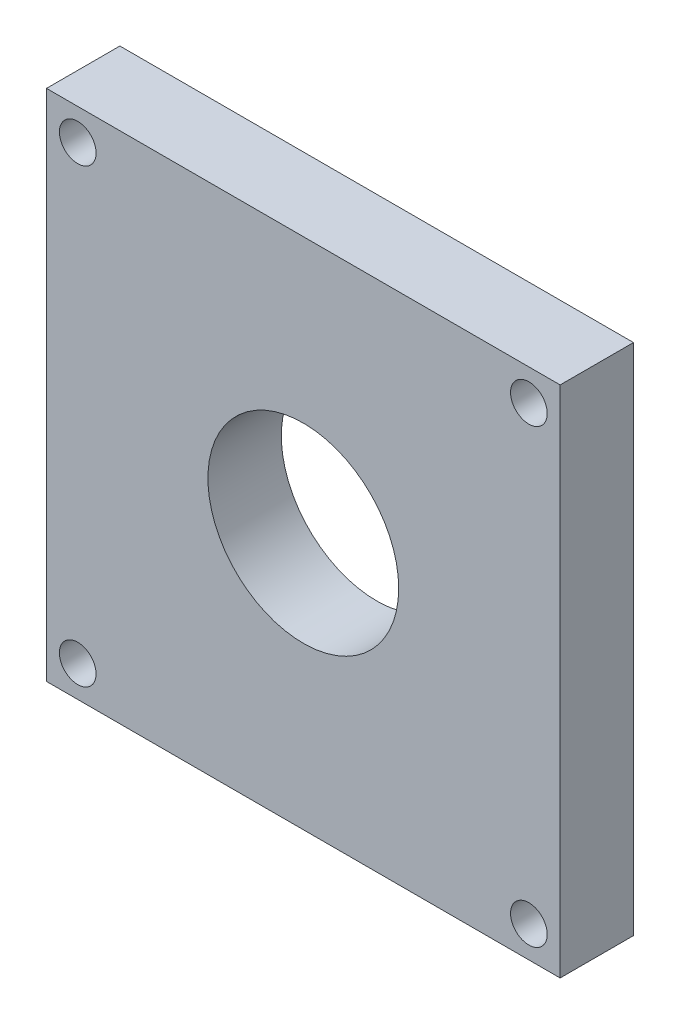
ISO-10303-21;
HEADER;
FILE_DESCRIPTION(('STEP AP214'),'2;1');
FILE_NAME('part.step','',(''),(''),'','','');
FILE_SCHEMA(('AUTOMOTIVE_DESIGN { 1 0 10303 214 1 1 1 1 }'));
ENDSEC;
DATA;
#1=APPLICATION_CONTEXT('core data for automotive mechanical design processes');
#2=APPLICATION_PROTOCOL_DEFINITION('international standard','automotive_design',2000,#1);
#3=PRODUCT_CONTEXT('',#1,'mechanical');
#4=PRODUCT('Part','Part','',(#3));
#5=PRODUCT_RELATED_PRODUCT_CATEGORY('part','',(#4));
#6=PRODUCT_DEFINITION_FORMATION('','',#4);
#7=PRODUCT_DEFINITION_CONTEXT('part definition',#1,'design');
#8=PRODUCT_DEFINITION('design','',#6,#7);
#9=PRODUCT_DEFINITION_SHAPE('','',#8);
#10=(LENGTH_UNIT() NAMED_UNIT(*) SI_UNIT(.MILLI.,.METRE.));
#11=(NAMED_UNIT(*) PLANE_ANGLE_UNIT() SI_UNIT($,.RADIAN.));
#12=(NAMED_UNIT(*) SI_UNIT($,.STERADIAN.) SOLID_ANGLE_UNIT());
#13=UNCERTAINTY_MEASURE_WITH_UNIT(LENGTH_MEASURE(1.E-05),#10,'distance_accuracy_value','');
#14=(GEOMETRIC_REPRESENTATION_CONTEXT(3) GLOBAL_UNCERTAINTY_ASSIGNED_CONTEXT((#13)) GLOBAL_UNIT_ASSIGNED_CONTEXT((#10,
#11,#12)) REPRESENTATION_CONTEXT('',''));
#15=CARTESIAN_POINT('',(0.,0.,0.));
#16=DIRECTION('',(0.,0.,1.));
#17=DIRECTION('',(1.,0.,0.));
#18=AXIS2_PLACEMENT_3D('',#15,#16,#17);
#19=CARTESIAN_POINT('',(0.,0.,5.));
#20=DIRECTION('',(0.,0.,1.));
#21=DIRECTION('',(1.,0.,0.));
#22=AXIS2_PLACEMENT_3D('',#19,#20,#21);
#23=PLANE('',#22);
#24=CARTESIAN_POINT('',(-15.37,-15.37,5.));
#25=DIRECTION('',(0.,0.,1.));
#26=DIRECTION('',(1.,0.,0.));
#27=AXIS2_PLACEMENT_3D('',#24,#25,#26);
#28=CIRCLE('',#27,1.25);
#29=CARTESIAN_POINT('',(-14.12,-15.37,5.));
#30=VERTEX_POINT('',#29);
#31=EDGE_CURVE('E127',#30,#30,#28,.T.);
#32=ORIENTED_EDGE('',*,*,#31,.F.);
#33=EDGE_LOOP('',(#32));
#34=FACE_BOUND('',#33,.T.);
#35=CARTESIAN_POINT('',(15.37,15.37,5.));
#36=DIRECTION('',(0.,0.,1.));
#37=DIRECTION('',(1.,0.,0.));
#38=AXIS2_PLACEMENT_3D('',#35,#36,#37);
#39=CIRCLE('',#38,1.25);
#40=CARTESIAN_POINT('',(16.62,15.37,5.));
#41=VERTEX_POINT('',#40);
#42=EDGE_CURVE('E115',#41,#41,#39,.T.);
#43=ORIENTED_EDGE('',*,*,#42,.F.);
#44=EDGE_LOOP('',(#43));
#45=FACE_BOUND('',#44,.T.);
#46=DIRECTION('',(0.,-1.,0.));
#47=VECTOR('',#46,1.);
#48=CARTESIAN_POINT('',(-17.5,-17.5,5.));
#49=LINE('',#48,#47);
#50=CARTESIAN_POINT('',(-17.5,17.5,5.));
#51=VERTEX_POINT('',#50);
#52=CARTESIAN_POINT('',(-17.5,-17.5,5.));
#53=VERTEX_POINT('',#52);
#54=EDGE_CURVE('E85',#51,#53,#49,.T.);
#55=ORIENTED_EDGE('',*,*,#54,.T.);
#56=DIRECTION('',(1.,0.,0.));
#57=VECTOR('',#56,1.);
#58=CARTESIAN_POINT('',(17.5,-17.5,5.));
#59=LINE('',#58,#57);
#60=CARTESIAN_POINT('',(17.5,-17.5,5.));
#61=VERTEX_POINT('',#60);
#62=EDGE_CURVE('E80',#53,#61,#59,.T.);
#63=ORIENTED_EDGE('',*,*,#62,.T.);
#64=DIRECTION('',(0.,1.,0.));
#65=VECTOR('',#64,1.);
#66=CARTESIAN_POINT('',(17.5,-17.5,5.));
#67=LINE('',#66,#65);
#68=CARTESIAN_POINT('',(17.5,17.5,5.));
#69=VERTEX_POINT('',#68);
#70=EDGE_CURVE('E83',#61,#69,#67,.T.);
#71=ORIENTED_EDGE('',*,*,#70,.T.);
#72=DIRECTION('',(-1.,0.,0.));
#73=VECTOR('',#72,1.);
#74=CARTESIAN_POINT('',(17.5,17.5,5.));
#75=LINE('',#74,#73);
#76=EDGE_CURVE('E50',#69,#51,#75,.T.);
#77=ORIENTED_EDGE('',*,*,#76,.T.);
#78=EDGE_LOOP('',(#55,#63,#71,#77));
#79=FACE_BOUND('',#78,.T.);
#80=CARTESIAN_POINT('',(-15.37,15.37,5.));
#81=DIRECTION('',(0.,0.,1.));
#82=DIRECTION('',(1.,0.,0.));
#83=AXIS2_PLACEMENT_3D('',#80,#81,#82);
#84=CIRCLE('',#83,1.25);
#85=CARTESIAN_POINT('',(-14.12,15.37,5.));
#86=VERTEX_POINT('',#85);
#87=EDGE_CURVE('E100',#86,#86,#84,.T.);
#88=ORIENTED_EDGE('',*,*,#87,.F.);
#89=EDGE_LOOP('',(#88));
#90=FACE_BOUND('',#89,.T.);
#91=CARTESIAN_POINT('',(15.37,-15.37,5.));
#92=DIRECTION('',(0.,0.,1.));
#93=DIRECTION('',(1.,0.,0.));
#94=AXIS2_PLACEMENT_3D('',#91,#92,#93);
#95=CIRCLE('',#94,1.25);
#96=CARTESIAN_POINT('',(16.62,-15.37,5.));
#97=VERTEX_POINT('',#96);
#98=EDGE_CURVE('E121',#97,#97,#95,.T.);
#99=ORIENTED_EDGE('',*,*,#98,.F.);
#100=EDGE_LOOP('',(#99));
#101=FACE_BOUND('',#100,.T.);
#102=CARTESIAN_POINT('',(0.,0.,5.));
#103=DIRECTION('',(0.,0.,1.));
#104=DIRECTION('',(1.,0.,0.));
#105=AXIS2_PLACEMENT_3D('',#102,#103,#104);
#106=CIRCLE('',#105,6.5);
#107=CARTESIAN_POINT('',(6.5,0.,5.));
#108=VERTEX_POINT('',#107);
#109=EDGE_CURVE('E133',#108,#108,#106,.T.);
#110=ORIENTED_EDGE('',*,*,#109,.F.);
#111=EDGE_LOOP('',(#110));
#112=FACE_BOUND('',#111,.T.);
#113=ADVANCED_FACE('F33',(#34,#45,#79,#90,#101,#112),#23,.T.);
#114=CARTESIAN_POINT('',(0.,0.,0.));
#115=DIRECTION('',(0.,0.,1.));
#116=DIRECTION('',(1.,0.,0.));
#117=AXIS2_PLACEMENT_3D('',#114,#115,#116);
#118=PLANE('',#117);
#119=DIRECTION('',(0.,-1.,0.));
#120=VECTOR('',#119,1.);
#121=CARTESIAN_POINT('',(-17.5,-17.5,0.));
#122=LINE('',#121,#120);
#123=CARTESIAN_POINT('',(-17.5,17.5,0.));
#124=VERTEX_POINT('',#123);
#125=CARTESIAN_POINT('',(-17.5,-17.5,0.));
#126=VERTEX_POINT('',#125);
#127=EDGE_CURVE('E97',#124,#126,#122,.T.);
#128=ORIENTED_EDGE('',*,*,#127,.F.);
#129=DIRECTION('',(-1.,0.,0.));
#130=VECTOR('',#129,1.);
#131=CARTESIAN_POINT('',(17.5,17.5,0.));
#132=LINE('',#131,#130);
#133=CARTESIAN_POINT('',(17.5,17.5,0.));
#134=VERTEX_POINT('',#133);
#135=EDGE_CURVE('E73',#134,#124,#132,.T.);
#136=ORIENTED_EDGE('',*,*,#135,.F.);
#137=DIRECTION('',(0.,1.,0.));
#138=VECTOR('',#137,1.);
#139=CARTESIAN_POINT('',(17.5,-17.5,0.));
#140=LINE('',#139,#138);
#141=CARTESIAN_POINT('',(17.5,-17.5,0.));
#142=VERTEX_POINT('',#141);
#143=EDGE_CURVE('E67',#142,#134,#140,.T.);
#144=ORIENTED_EDGE('',*,*,#143,.F.);
#145=DIRECTION('',(1.,0.,0.));
#146=VECTOR('',#145,1.);
#147=CARTESIAN_POINT('',(17.5,-17.5,0.));
#148=LINE('',#147,#146);
#149=EDGE_CURVE('E89',#126,#142,#148,.T.);
#150=ORIENTED_EDGE('',*,*,#149,.F.);
#151=EDGE_LOOP('',(#128,#136,#144,#150));
#152=FACE_BOUND('',#151,.T.);
#153=CARTESIAN_POINT('',(-15.37,15.37,0.));
#154=DIRECTION('',(0.,0.,1.));
#155=DIRECTION('',(1.,0.,0.));
#156=AXIS2_PLACEMENT_3D('',#153,#154,#155);
#157=CIRCLE('',#156,1.25);
#158=CARTESIAN_POINT('',(-14.12,15.37,0.));
#159=VERTEX_POINT('',#158);
#160=EDGE_CURVE('E112',#159,#159,#157,.T.);
#161=ORIENTED_EDGE('',*,*,#160,.T.);
#162=EDGE_LOOP('',(#161));
#163=FACE_BOUND('',#162,.T.);
#164=CARTESIAN_POINT('',(15.37,15.37,0.));
#165=DIRECTION('',(0.,0.,1.));
#166=DIRECTION('',(1.,0.,0.));
#167=AXIS2_PLACEMENT_3D('',#164,#165,#166);
#168=CIRCLE('',#167,1.25);
#169=CARTESIAN_POINT('',(16.62,15.37,0.));
#170=VERTEX_POINT('',#169);
#171=EDGE_CURVE('E118',#170,#170,#168,.T.);
#172=ORIENTED_EDGE('',*,*,#171,.T.);
#173=EDGE_LOOP('',(#172));
#174=FACE_BOUND('',#173,.T.);
#175=CARTESIAN_POINT('',(15.37,-15.37,0.));
#176=DIRECTION('',(0.,0.,1.));
#177=DIRECTION('',(1.,0.,0.));
#178=AXIS2_PLACEMENT_3D('',#175,#176,#177);
#179=CIRCLE('',#178,1.25);
#180=CARTESIAN_POINT('',(16.62,-15.37,0.));
#181=VERTEX_POINT('',#180);
#182=EDGE_CURVE('E124',#181,#181,#179,.T.);
#183=ORIENTED_EDGE('',*,*,#182,.T.);
#184=EDGE_LOOP('',(#183));
#185=FACE_BOUND('',#184,.T.);
#186=CARTESIAN_POINT('',(-15.37,-15.37,0.));
#187=DIRECTION('',(0.,0.,1.));
#188=DIRECTION('',(1.,0.,0.));
#189=AXIS2_PLACEMENT_3D('',#186,#187,#188);
#190=CIRCLE('',#189,1.25);
#191=CARTESIAN_POINT('',(-14.12,-15.37,0.));
#192=VERTEX_POINT('',#191);
#193=EDGE_CURVE('E130',#192,#192,#190,.T.);
#194=ORIENTED_EDGE('',*,*,#193,.T.);
#195=EDGE_LOOP('',(#194));
#196=FACE_BOUND('',#195,.T.);
#197=CARTESIAN_POINT('',(0.,0.,0.));
#198=DIRECTION('',(0.,0.,1.));
#199=DIRECTION('',(1.,0.,0.));
#200=AXIS2_PLACEMENT_3D('',#197,#198,#199);
#201=CIRCLE('',#200,6.5);
#202=CARTESIAN_POINT('',(6.5,0.,0.));
#203=VERTEX_POINT('',#202);
#204=EDGE_CURVE('E136',#203,#203,#201,.T.);
#205=ORIENTED_EDGE('',*,*,#204,.T.);
#206=EDGE_LOOP('',(#205));
#207=FACE_BOUND('',#206,.T.);
#208=ADVANCED_FACE('F108',(#152,#163,#174,#185,#196,#207),#118,.F.);
#209=CARTESIAN_POINT('',(-17.5,-17.5,5.));
#210=DIRECTION('',(1.,0.,0.));
#211=DIRECTION('',(0.,0.,-1.));
#212=AXIS2_PLACEMENT_3D('',#209,#210,#211);
#213=PLANE('',#212);
#214=ORIENTED_EDGE('',*,*,#127,.T.);
#215=DIRECTION('',(0.,0.,-1.));
#216=VECTOR('',#215,1.);
#217=CARTESIAN_POINT('',(-17.5,-17.5,5.));
#218=LINE('',#217,#216);
#219=EDGE_CURVE('E11',#53,#126,#218,.T.);
#220=ORIENTED_EDGE('',*,*,#219,.F.);
#221=ORIENTED_EDGE('',*,*,#54,.F.);
#222=DIRECTION('',(0.,0.,-1.));
#223=VECTOR('',#222,1.);
#224=CARTESIAN_POINT('',(-17.5,17.5,5.));
#225=LINE('',#224,#223);
#226=EDGE_CURVE('E93',#51,#124,#225,.T.);
#227=ORIENTED_EDGE('',*,*,#226,.T.);
#228=EDGE_LOOP('',(#214,#220,#221,#227));
#229=FACE_BOUND('',#228,.T.);
#230=ADVANCED_FACE('F35',(#229),#213,.F.);
#231=CARTESIAN_POINT('',(17.5,-17.5,5.));
#232=DIRECTION('',(0.,1.,0.));
#233=DIRECTION('',(0.,0.,1.));
#234=AXIS2_PLACEMENT_3D('',#231,#232,#233);
#235=PLANE('',#234);
#236=ORIENTED_EDGE('',*,*,#149,.T.);
#237=DIRECTION('',(0.,0.,-1.));
#238=VECTOR('',#237,1.);
#239=CARTESIAN_POINT('',(17.5,-17.5,5.));
#240=LINE('',#239,#238);
#241=EDGE_CURVE('E42',#61,#142,#240,.T.);
#242=ORIENTED_EDGE('',*,*,#241,.F.);
#243=ORIENTED_EDGE('',*,*,#62,.F.);
#244=ORIENTED_EDGE('',*,*,#219,.T.);
#245=EDGE_LOOP('',(#236,#242,#243,#244));
#246=FACE_BOUND('',#245,.T.);
#247=ADVANCED_FACE('F88',(#246),#235,.F.);
#248=CARTESIAN_POINT('',(17.5,-17.5,5.));
#249=DIRECTION('',(-1.,0.,0.));
#250=DIRECTION('',(0.,0.,1.));
#251=AXIS2_PLACEMENT_3D('',#248,#249,#250);
#252=PLANE('',#251);
#253=ORIENTED_EDGE('',*,*,#143,.T.);
#254=DIRECTION('',(0.,0.,-1.));
#255=VECTOR('',#254,1.);
#256=CARTESIAN_POINT('',(17.5,17.5,5.));
#257=LINE('',#256,#255);
#258=EDGE_CURVE('E90',#69,#134,#257,.T.);
#259=ORIENTED_EDGE('',*,*,#258,.F.);
#260=ORIENTED_EDGE('',*,*,#70,.F.);
#261=ORIENTED_EDGE('',*,*,#241,.T.);
#262=EDGE_LOOP('',(#253,#259,#260,#261));
#263=FACE_BOUND('',#262,.T.);
#264=ADVANCED_FACE('F91',(#263),#252,.F.);
#265=CARTESIAN_POINT('',(17.5,17.5,5.));
#266=DIRECTION('',(0.,-1.,0.));
#267=DIRECTION('',(0.,0.,-1.));
#268=AXIS2_PLACEMENT_3D('',#265,#266,#267);
#269=PLANE('',#268);
#270=ORIENTED_EDGE('',*,*,#135,.T.);
#271=ORIENTED_EDGE('',*,*,#226,.F.);
#272=ORIENTED_EDGE('',*,*,#76,.F.);
#273=ORIENTED_EDGE('',*,*,#258,.T.);
#274=EDGE_LOOP('',(#270,#271,#272,#273));
#275=FACE_BOUND('',#274,.T.);
#276=ADVANCED_FACE('F105',(#275),#269,.F.);
#277=CARTESIAN_POINT('',(-15.37,15.37,5.));
#278=DIRECTION('',(0.,0.,-1.));
#279=DIRECTION('',(-1.,0.,0.));
#280=AXIS2_PLACEMENT_3D('',#277,#278,#279);
#281=CYLINDRICAL_SURFACE('',#280,1.25);
#282=ORIENTED_EDGE('',*,*,#87,.T.);
#283=EDGE_LOOP('',(#282));
#284=FACE_BOUND('',#283,.T.);
#285=ORIENTED_EDGE('',*,*,#160,.F.);
#286=EDGE_LOOP('',(#285));
#287=FACE_BOUND('',#286,.T.);
#288=ADVANCED_FACE('F155',(#284,#287),#281,.F.);
#289=CARTESIAN_POINT('',(15.37,15.37,5.));
#290=DIRECTION('',(0.,0.,-1.));
#291=DIRECTION('',(-1.,0.,0.));
#292=AXIS2_PLACEMENT_3D('',#289,#290,#291);
#293=CYLINDRICAL_SURFACE('',#292,1.25);
#294=ORIENTED_EDGE('',*,*,#42,.T.);
#295=EDGE_LOOP('',(#294));
#296=FACE_BOUND('',#295,.T.);
#297=ORIENTED_EDGE('',*,*,#171,.F.);
#298=EDGE_LOOP('',(#297));
#299=FACE_BOUND('',#298,.T.);
#300=ADVANCED_FACE('F201',(#296,#299),#293,.F.);
#301=CARTESIAN_POINT('',(15.37,-15.37,5.));
#302=DIRECTION('',(0.,0.,-1.));
#303=DIRECTION('',(-1.,0.,0.));
#304=AXIS2_PLACEMENT_3D('',#301,#302,#303);
#305=CYLINDRICAL_SURFACE('',#304,1.25);
#306=ORIENTED_EDGE('',*,*,#98,.T.);
#307=EDGE_LOOP('',(#306));
#308=FACE_BOUND('',#307,.T.);
#309=ORIENTED_EDGE('',*,*,#182,.F.);
#310=EDGE_LOOP('',(#309));
#311=FACE_BOUND('',#310,.T.);
#312=ADVANCED_FACE('F209',(#308,#311),#305,.F.);
#313=CARTESIAN_POINT('',(-15.37,-15.37,5.));
#314=DIRECTION('',(0.,0.,-1.));
#315=DIRECTION('',(-1.,0.,0.));
#316=AXIS2_PLACEMENT_3D('',#313,#314,#315);
#317=CYLINDRICAL_SURFACE('',#316,1.25);
#318=ORIENTED_EDGE('',*,*,#31,.T.);
#319=EDGE_LOOP('',(#318));
#320=FACE_BOUND('',#319,.T.);
#321=ORIENTED_EDGE('',*,*,#193,.F.);
#322=EDGE_LOOP('',(#321));
#323=FACE_BOUND('',#322,.T.);
#324=ADVANCED_FACE('F217',(#320,#323),#317,.F.);
#325=CARTESIAN_POINT('',(0.,0.,5.));
#326=DIRECTION('',(0.,0.,-1.));
#327=DIRECTION('',(-1.,0.,0.));
#328=AXIS2_PLACEMENT_3D('',#325,#326,#327);
#329=CYLINDRICAL_SURFACE('',#328,6.5);
#330=ORIENTED_EDGE('',*,*,#109,.T.);
#331=EDGE_LOOP('',(#330));
#332=FACE_BOUND('',#331,.T.);
#333=ORIENTED_EDGE('',*,*,#204,.F.);
#334=EDGE_LOOP('',(#333));
#335=FACE_BOUND('',#334,.T.);
#336=ADVANCED_FACE('F142',(#332,#335),#329,.F.);
#337=CLOSED_SHELL('',(#113,#208,#230,#247,#264,#276,#288,#300,#312,#324,#336));
#338=MANIFOLD_SOLID_BREP('B2',#337);
#339=ADVANCED_BREP_SHAPE_REPRESENTATION('',(#18,#338),#14);
#340=SHAPE_DEFINITION_REPRESENTATION(#9,#339);
ENDSEC;
END-ISO-10303-21;
